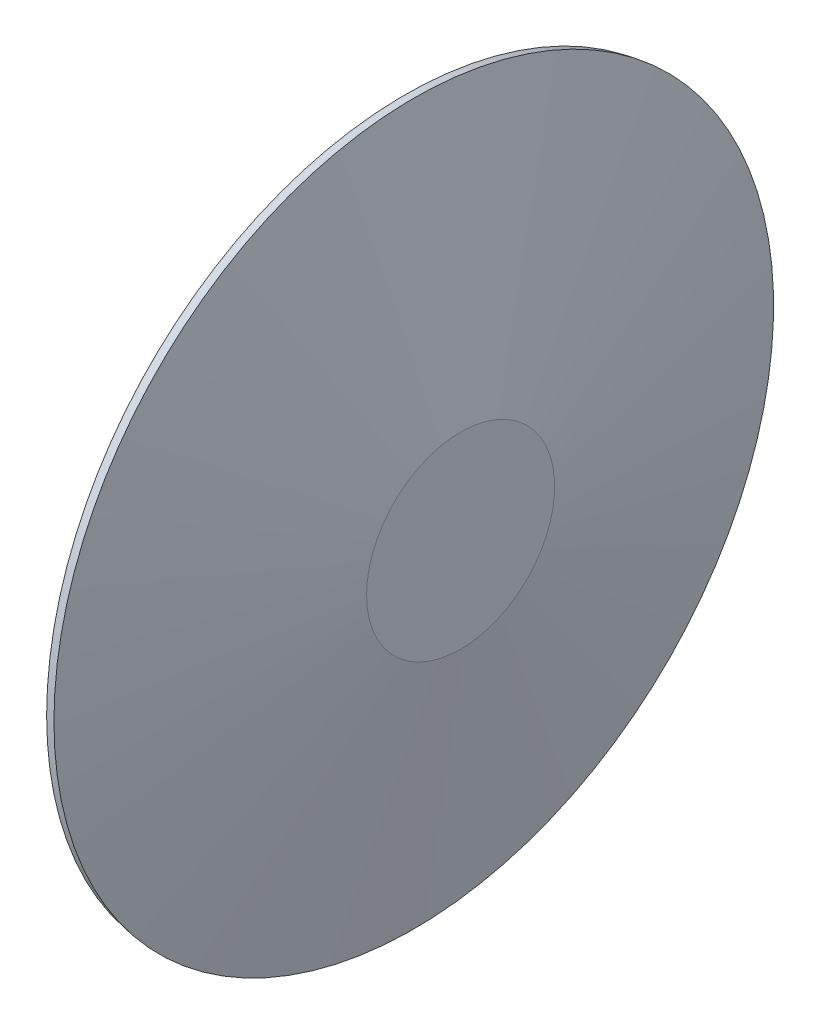
ISO-10303-21;
HEADER;
FILE_DESCRIPTION(('STEP AP214'),'2;1');
FILE_NAME('part.step','',(''),(''),'','','');
FILE_SCHEMA(('AUTOMOTIVE_DESIGN { 1 0 10303 214 1 1 1 1 }'));
ENDSEC;
DATA;
#1=APPLICATION_CONTEXT('core data for automotive mechanical design processes');
#2=APPLICATION_PROTOCOL_DEFINITION('international standard','automotive_design',2000,#1);
#3=PRODUCT_CONTEXT('',#1,'mechanical');
#4=PRODUCT('Part','Part','',(#3));
#5=PRODUCT_RELATED_PRODUCT_CATEGORY('part','',(#4));
#6=PRODUCT_DEFINITION_FORMATION('','',#4);
#7=PRODUCT_DEFINITION_CONTEXT('part definition',#1,'design');
#8=PRODUCT_DEFINITION('design','',#6,#7);
#9=PRODUCT_DEFINITION_SHAPE('','',#8);
#10=(LENGTH_UNIT() NAMED_UNIT(*) SI_UNIT(.MILLI.,.METRE.));
#11=(NAMED_UNIT(*) PLANE_ANGLE_UNIT() SI_UNIT($,.RADIAN.));
#12=(NAMED_UNIT(*) SI_UNIT($,.STERADIAN.) SOLID_ANGLE_UNIT());
#13=UNCERTAINTY_MEASURE_WITH_UNIT(LENGTH_MEASURE(1.E-05),#10,'distance_accuracy_value','');
#14=(GEOMETRIC_REPRESENTATION_CONTEXT(3) GLOBAL_UNCERTAINTY_ASSIGNED_CONTEXT((#13)) GLOBAL_UNIT_ASSIGNED_CONTEXT((#10,
#11,#12)) REPRESENTATION_CONTEXT('',''));
#15=CARTESIAN_POINT('',(0.,0.,0.));
#16=DIRECTION('',(0.,0.,1.));
#17=DIRECTION('',(1.,0.,0.));
#18=AXIS2_PLACEMENT_3D('',#15,#16,#17);
#19=CARTESIAN_POINT('',(0.,0.,0.));
#20=DIRECTION('',(-1.,0.,0.));
#21=DIRECTION('',(0.,0.,1.));
#22=AXIS2_PLACEMENT_3D('',#19,#20,#21);
#23=PLANE('',#22);
#24=CARTESIAN_POINT('',(0.,0.,0.));
#25=DIRECTION('',(-1.,0.,0.));
#26=DIRECTION('',(0.,0.,1.));
#27=AXIS2_PLACEMENT_3D('',#24,#25,#26);
#28=CIRCLE('',#27,20.9115348192675);
#29=CARTESIAN_POINT('',(0.,0.,20.9115348192675));
#30=VERTEX_POINT('',#29);
#31=EDGE_CURVE('E46',#30,#30,#28,.T.);
#32=ORIENTED_EDGE('',*,*,#31,.F.);
#33=EDGE_LOOP('',(#32));
#34=FACE_BOUND('',#33,.T.);
#35=ADVANCED_FACE('F39',(#34),#23,.F.);
#36=CARTESIAN_POINT('',(0.,0.,0.));
#37=DIRECTION('',(-1.,0.,0.));
#38=DIRECTION('',(0.,0.,1.));
#39=AXIS2_PLACEMENT_3D('',#36,#37,#38);
#40=CONICAL_SURFACE('',#39,20.9115348192675,1.39626340159546);
#41=CARTESIAN_POINT('',(-10.4188906600159,0.,0.));
#42=DIRECTION('',(-1.,0.,0.));
#43=DIRECTION('',(0.,0.,1.));
#44=AXIS2_PLACEMENT_3D('',#41,#42,#43);
#45=CIRCLE('',#44,80.);
#46=CARTESIAN_POINT('',(-10.4188906600159,0.,80.));
#47=VERTEX_POINT('',#46);
#48=EDGE_CURVE('E51',#47,#47,#45,.T.);
#49=CARTESIAN_POINT('',(-10.4188906600159,0.,80.));
#50=CARTESIAN_POINT('',(-10.310360548974,0.,79.3844951543674));
#51=CARTESIAN_POINT('',(-10.2018304379322,0.,78.7689903087347));
#52=CARTESIAN_POINT('',(-9.98477021584854,0.,77.5379806174695));
#53=CARTESIAN_POINT('',(-9.87624010480671,0.,76.9224757718368));
#54=CARTESIAN_POINT('',(-9.65917988272305,0.,75.6914660805716));
#55=CARTESIAN_POINT('',(-9.55064977168121,0.,75.0759612349389));
#56=CARTESIAN_POINT('',(-9.33358954959755,0.,73.8449515436737));
#57=CARTESIAN_POINT('',(-9.22505943855572,0.,73.2294466980411));
#58=CARTESIAN_POINT('',(-9.00799921647205,0.,71.9984370067758));
#59=CARTESIAN_POINT('',(-8.89946910543022,0.,71.3829321611432));
#60=CARTESIAN_POINT('',(-8.68240888334656,0.,70.1519224698779));
#61=CARTESIAN_POINT('',(-8.57387877230473,0.,69.5364176242453));
#62=CARTESIAN_POINT('',(-8.35681855022106,0.,68.30540793298));
#63=CARTESIAN_POINT('',(-8.24828843917923,0.,67.6899030873474));
#64=CARTESIAN_POINT('',(-8.03122821709557,0.,66.4588933960821));
#65=CARTESIAN_POINT('',(-7.92269810605373,0.,65.8433885504495));
#66=CARTESIAN_POINT('',(-7.70563788397007,0.,64.6123788591842));
#67=CARTESIAN_POINT('',(-7.59710777292824,0.,63.9968740135516));
#68=CARTESIAN_POINT('',(-7.38004755084457,0.,62.7658643222864));
#69=CARTESIAN_POINT('',(-7.27151743980274,0.,62.1503594766537));
#70=CARTESIAN_POINT('',(-7.05445721771908,0.,60.9193497853885));
#71=CARTESIAN_POINT('',(-6.94592710667724,0.,60.3038449397558));
#72=CARTESIAN_POINT('',(-6.72886688459358,0.,59.0728352484906));
#73=CARTESIAN_POINT('',(-6.62033677355175,0.,58.4573304028579));
#74=CARTESIAN_POINT('',(-6.40327655146809,0.,57.2263207115927));
#75=CARTESIAN_POINT('',(-6.29474644042625,0.,56.6108158659601));
#76=CARTESIAN_POINT('',(-6.07768621834259,0.,55.3798061746948));
#77=CARTESIAN_POINT('',(-5.96915610730076,0.,54.7643013290622));
#78=CARTESIAN_POINT('',(-5.75209588521709,0.,53.5332916377969));
#79=CARTESIAN_POINT('',(-5.64356577417526,0.,52.9177867921643));
#80=CARTESIAN_POINT('',(-5.4265055520916,0.,51.686777100899));
#81=CARTESIAN_POINT('',(-5.31797544104977,0.,51.0712722552664));
#82=CARTESIAN_POINT('',(-5.1009152189661,0.,49.8402625640011));
#83=CARTESIAN_POINT('',(-4.99238510792427,0.,49.2247577183685));
#84=CARTESIAN_POINT('',(-4.7753248858406,0.,47.9937480271032));
#85=CARTESIAN_POINT('',(-4.66679477479877,0.,47.3782431814706));
#86=CARTESIAN_POINT('',(-4.44973455271511,0.,46.1472334902054));
#87=CARTESIAN_POINT('',(-4.34120444167328,0.,45.5317286445727));
#88=CARTESIAN_POINT('',(-4.12414421958961,0.,44.3007189533075));
#89=CARTESIAN_POINT('',(-4.01561410854778,0.,43.6852141076748));
#90=CARTESIAN_POINT('',(-3.79855388646412,0.,42.4542044164096));
#91=CARTESIAN_POINT('',(-3.69002377542228,0.,41.8386995707769));
#92=CARTESIAN_POINT('',(-3.47296355333862,0.,40.6076898795117));
#93=CARTESIAN_POINT('',(-3.36443344229679,0.,39.9921850338791));
#94=CARTESIAN_POINT('',(-3.14737322021312,0.,38.7611753426138));
#95=CARTESIAN_POINT('',(-3.03884310917129,0.,38.1456704969812));
#96=CARTESIAN_POINT('',(-2.82178288708763,0.,36.9146608057159));
#97=CARTESIAN_POINT('',(-2.7132527760458,0.,36.2991559600833));
#98=CARTESIAN_POINT('',(-2.49619255396213,0.,35.068146268818));
#99=CARTESIAN_POINT('',(-2.3876624429203,0.,34.4526414231854));
#100=CARTESIAN_POINT('',(-2.17060222083664,0.,33.2216317319201));
#101=CARTESIAN_POINT('',(-2.0620721097948,0.,32.6061268862875));
#102=CARTESIAN_POINT('',(-1.84501188771114,0.,31.3751171950222));
#103=CARTESIAN_POINT('',(-1.73648177666931,0.,30.7596123493896));
#104=CARTESIAN_POINT('',(-1.51942155458564,0.,29.5286026581244));
#105=CARTESIAN_POINT('',(-1.41089144354381,0.,28.9130978124917));
#106=CARTESIAN_POINT('',(-1.19383122146015,0.,27.6820881212265));
#107=CARTESIAN_POINT('',(-1.08530111041832,0.,27.0665832755938));
#108=CARTESIAN_POINT('',(-0.868240888334651,0.,25.8355735843286));
#109=CARTESIAN_POINT('',(-0.75971077729282,0.,25.2200687386959));
#110=CARTESIAN_POINT('',(-0.542650555209156,0.,23.9890590474307));
#111=CARTESIAN_POINT('',(-0.434120444167323,0.,23.3735542017981));
#112=CARTESIAN_POINT('',(-0.217060222083659,0.,22.1425445105328));
#113=CARTESIAN_POINT('',(-0.108530111041827,0.,21.5270396649002));
#114=CARTESIAN_POINT('',(0.,0.,20.9115348192675));
#115=B_SPLINE_CURVE_WITH_KNOTS('',3,(#49,#50,#51,#52,#53,#54,#55,#56,#57,#58,#59,#60,#61,#62,
#63,#64,#65,#66,#67,#68,#69,#70,#71,#72,#73,#74,#75,#76,#77,#78,#79,#80,#81,#82,#83,#84,#85,#86,
#87,#88,#89,#90,#91,#92,#93,#94,#95,#96,#97,#98,#99,#100,#101,#102,#103,#104,#105,#106,#107,
#108,#109,#110,#111,#112,#113,#114),.UNSPECIFIED.,.F.,.F.,(4,2,2,2,2,2,2,2,2,2,2,2,2,2,2,2,2,2,
2,2,2,2,2,2,2,2,2,2,2,2,2,2,4),(0.,1.875,3.75000000000001,5.625,7.49999999999999,9.375,11.25,
13.125,15.,16.875,18.75,20.625,22.5,24.375,26.25,28.125,30.,31.875,33.75,35.625,37.5,39.375,
41.25,43.125,45.,46.875,48.75,50.625,52.5,54.375,56.2499999999999,58.125,60.),.UNSPECIFIED.);
#116=EDGE_CURVE('BSEAM86',#47,#30,#115,.T.);
#117=ORIENTED_EDGE('',*,*,#48,.F.);
#118=ORIENTED_EDGE('',*,*,#31,.T.);
#119=ORIENTED_EDGE('',*,*,#116,.T.);
#120=ORIENTED_EDGE('',*,*,#116,.F.);
#121=EDGE_LOOP('',(#117,#119,#118,#120));
#122=FACE_BOUND('',#121,.T.);
#123=ADVANCED_FACE('F86',(#122),#40,.T.);
#124=CARTESIAN_POINT('',(-10.4188906600159,0.,0.));
#125=DIRECTION('',(1.,0.,0.));
#126=DIRECTION('',(0.,0.,-1.));
#127=AXIS2_PLACEMENT_3D('',#124,#125,#126);
#128=CONICAL_SURFACE('',#127,80.,0.174532925199424);
#129=CARTESIAN_POINT('',(-12.3885061660403,0.,0.));
#130=DIRECTION('',(-1.,0.,0.));
#131=DIRECTION('',(0.,0.,1.));
#132=AXIS2_PLACEMENT_3D('',#129,#130,#131);
#133=CIRCLE('',#132,79.6527036446662);
#134=CARTESIAN_POINT('',(-12.3885061660403,0.,79.6527036446662));
#135=VERTEX_POINT('',#134);
#136=EDGE_CURVE('E56',#135,#135,#133,.T.);
#137=ORIENTED_EDGE('',*,*,#136,.F.);
#138=EDGE_LOOP('',(#137));
#139=FACE_BOUND('',#138,.T.);
#140=ORIENTED_EDGE('',*,*,#48,.T.);
#141=EDGE_LOOP('',(#140));
#142=FACE_BOUND('',#141,.T.);
#143=ADVANCED_FACE('F91',(#139,#142),#128,.T.);
#144=CARTESIAN_POINT('',(-12.3885061660403,0.,0.));
#145=DIRECTION('',(-1.,0.,0.));
#146=DIRECTION('',(0.,0.,1.));
#147=AXIS2_PLACEMENT_3D('',#144,#145,#146);
#148=CONICAL_SURFACE('',#147,79.6527036446662,1.39626340159546);
#149=CARTESIAN_POINT('',(-2.,0.,0.));
#150=DIRECTION('',(-1.,0.,0.));
#151=DIRECTION('',(0.,0.,1.));
#152=AXIS2_PLACEMENT_3D('',#149,#150,#151);
#153=CIRCLE('',#152,20.7365574922158);
#154=CARTESIAN_POINT('',(-2.,0.,20.7365574922158));
#155=VERTEX_POINT('',#154);
#156=EDGE_CURVE('E62',#155,#155,#153,.T.);
#157=CARTESIAN_POINT('',(-2.,0.,20.7365574922158));
#158=CARTESIAN_POINT('',(-2.10821360589625,0.,21.3502673479705));
#159=CARTESIAN_POINT('',(-2.21642721179251,0.,21.9639772037252));
#160=CARTESIAN_POINT('',(-2.43285442358501,0.,23.1913969152346));
#161=CARTESIAN_POINT('',(-2.54106802948126,0.,23.8051067709893));
#162=CARTESIAN_POINT('',(-2.75749524127377,0.,25.0325264824987));
#163=CARTESIAN_POINT('',(-2.86570884717002,0.,25.6462363382533));
#164=CARTESIAN_POINT('',(-3.08213605896253,0.,26.8736560497627));
#165=CARTESIAN_POINT('',(-3.19034966485878,0.,27.4873659055174));
#166=CARTESIAN_POINT('',(-3.40677687665129,0.,28.7147856170268));
#167=CARTESIAN_POINT('',(-3.51499048254754,0.,29.3284954727815));
#168=CARTESIAN_POINT('',(-3.73141769434005,0.,30.5559151842909));
#169=CARTESIAN_POINT('',(-3.8396313002363,0.,31.1696250400456));
#170=CARTESIAN_POINT('',(-4.05605851202881,0.,32.3970447515549));
#171=CARTESIAN_POINT('',(-4.16427211792506,0.,33.0107546073096));
#172=CARTESIAN_POINT('',(-4.38069932971757,0.,34.238174318819));
#173=CARTESIAN_POINT('',(-4.48891293561382,0.,34.8518841745737));
#174=CARTESIAN_POINT('',(-4.70534014740633,0.,36.0793038860831));
#175=CARTESIAN_POINT('',(-4.81355375330258,0.,36.6930137418378));
#176=CARTESIAN_POINT('',(-5.02998096509508,0.,37.9204334533472));
#177=CARTESIAN_POINT('',(-5.13819457099134,0.,38.5341433091019));
#178=CARTESIAN_POINT('',(-5.35462178278384,0.,39.7615630206112));
#179=CARTESIAN_POINT('',(-5.4628353886801,0.,40.3752728763659));
#180=CARTESIAN_POINT('',(-5.6792626004726,0.,41.6026925878753));
#181=CARTESIAN_POINT('',(-5.78747620636886,0.,42.21640244363));
#182=CARTESIAN_POINT('',(-6.00390341816136,0.,43.4438221551394));
#183=CARTESIAN_POINT('',(-6.11211702405761,0.,44.0575320108941));
#184=CARTESIAN_POINT('',(-6.32854423585012,0.,45.2849517224035));
#185=CARTESIAN_POINT('',(-6.43675784174637,0.,45.8986615781582));
#186=CARTESIAN_POINT('',(-6.65318505353888,0.,47.1260812896675));
#187=CARTESIAN_POINT('',(-6.76139865943513,0.,47.7397911454222));
#188=CARTESIAN_POINT('',(-6.97782587122764,0.,48.9672108569316));
#189=CARTESIAN_POINT('',(-7.08603947712389,0.,49.5809207126863));
#190=CARTESIAN_POINT('',(-7.3024666889164,0.,50.8083404241957));
#191=CARTESIAN_POINT('',(-7.41068029481265,0.,51.4220502799504));
#192=CARTESIAN_POINT('',(-7.62710750660516,0.,52.6494699914598));
#193=CARTESIAN_POINT('',(-7.73532111250141,0.,53.2631798472144));
#194=CARTESIAN_POINT('',(-7.95174832429391,0.,54.4905995587238));
#195=CARTESIAN_POINT('',(-8.05996193019017,0.,55.1043094144785));
#196=CARTESIAN_POINT('',(-8.27638914198267,0.,56.3317291259879));
#197=CARTESIAN_POINT('',(-8.38460274787893,0.,56.9454389817426));
#198=CARTESIAN_POINT('',(-8.60102995967143,0.,58.172858693252));
#199=CARTESIAN_POINT('',(-8.70924356556769,0.,58.7865685490067));
#200=CARTESIAN_POINT('',(-8.92567077736019,0.,60.0139882605161));
#201=CARTESIAN_POINT('',(-9.03388438325645,0.,60.6276981162707));
#202=CARTESIAN_POINT('',(-9.25031159504895,0.,61.8551178277801));
#203=CARTESIAN_POINT('',(-9.3585252009452,0.,62.4688276835348));
#204=CARTESIAN_POINT('',(-9.57495241273771,0.,63.6962473950442));
#205=CARTESIAN_POINT('',(-9.68316601863396,0.,64.3099572507989));
#206=CARTESIAN_POINT('',(-9.89959323042647,0.,65.5373769623083));
#207=CARTESIAN_POINT('',(-10.0078068363227,0.,66.151086818063));
#208=CARTESIAN_POINT('',(-10.2242340481152,0.,67.3785065295723));
#209=CARTESIAN_POINT('',(-10.3324476540115,0.,67.992216385327));
#210=CARTESIAN_POINT('',(-10.548874865804,0.,69.2196360968364));
#211=CARTESIAN_POINT('',(-10.6570884717002,0.,69.8333459525911));
#212=CARTESIAN_POINT('',(-10.8735156834927,0.,71.0607656641005));
#213=CARTESIAN_POINT('',(-10.981729289389,0.,71.6744755198552));
#214=CARTESIAN_POINT('',(-11.1981565011815,0.,72.9018952313646));
#215=CARTESIAN_POINT('',(-11.3063701070778,0.,73.5156050871192));
#216=CARTESIAN_POINT('',(-11.5227973188703,0.,74.7430247986286));
#217=CARTESIAN_POINT('',(-11.6310109247665,0.,75.3567346543833));
#218=CARTESIAN_POINT('',(-11.847438136559,0.,76.5841543658927));
#219=CARTESIAN_POINT('',(-11.9556517424553,0.,77.1978642216474));
#220=CARTESIAN_POINT('',(-12.1720789542478,0.,78.4252839331568));
#221=CARTESIAN_POINT('',(-12.280292560144,0.,79.0389937889115));
#222=CARTESIAN_POINT('',(-12.3885061660403,0.,79.6527036446662));
#223=B_SPLINE_CURVE_WITH_KNOTS('',3,(#157,#158,#159,#160,#161,#162,#163,#164,#165,#166,#167,
#168,#169,#170,#171,#172,#173,#174,#175,#176,#177,#178,#179,#180,#181,#182,#183,#184,#185,#186,
#187,#188,#189,#190,#191,#192,#193,#194,#195,#196,#197,#198,#199,#200,#201,#202,#203,#204,#205,
#206,#207,#208,#209,#210,#211,#212,#213,#214,#215,#216,#217,#218,#219,#220,#221,#222),
.UNSPECIFIED.,.F.,.F.,(4,2,2,2,2,2,2,2,2,2,2,2,2,2,2,2,2,2,2,2,2,2,2,2,2,2,2,2,2,2,2,2,4),(0.,
1.86953195852963,3.73906391705925,5.60859587558888,7.4781278341185,9.34765979264813,
11.2171917511777,13.0867237097074,14.956255668237,16.8257876267666,18.6953195852963,
20.5648515438259,22.4343835023555,24.3039154608851,26.1734474194148,28.0429793779444,
29.912511336474,31.7820432950036,33.6515752535333,35.5211072120629,37.3906391705925,
39.2601711291221,41.1297030876518,42.9992350461814,44.868767004711,46.7382989632406,
48.6078309217703,50.4773628802999,52.3468948388295,54.2164267973591,56.0859587558888,
57.9554907144184,59.825022672948),.UNSPECIFIED.);
#224=EDGE_CURVE('BSEAM82',#155,#135,#223,.T.);
#225=ORIENTED_EDGE('',*,*,#156,.F.);
#226=ORIENTED_EDGE('',*,*,#136,.T.);
#227=ORIENTED_EDGE('',*,*,#224,.T.);
#228=ORIENTED_EDGE('',*,*,#224,.F.);
#229=EDGE_LOOP('',(#225,#227,#226,#228));
#230=FACE_BOUND('',#229,.T.);
#231=ADVANCED_FACE('F82',(#230),#148,.F.);
#232=CARTESIAN_POINT('',(-2.,20.7365574922158,0.));
#233=DIRECTION('',(1.,0.,0.));
#234=DIRECTION('',(0.,0.,-1.));
#235=AXIS2_PLACEMENT_3D('',#232,#233,#234);
#236=PLANE('',#235);
#237=CARTESIAN_POINT('',(-2.,0.,0.));
#238=DIRECTION('',(1.,0.,0.));
#239=DIRECTION('',(0.,0.,-1.));
#240=AXIS2_PLACEMENT_3D('',#237,#238,#239);
#241=CIRCLE('',#240,7.5);
#242=CARTESIAN_POINT('',(-2.,0.,-7.5));
#243=VERTEX_POINT('',#242);
#244=EDGE_CURVE('E10',#243,#243,#241,.F.);
#245=ORIENTED_EDGE('',*,*,#244,.F.);
#246=EDGE_LOOP('',(#245));
#247=FACE_BOUND('',#246,.T.);
#248=ORIENTED_EDGE('',*,*,#156,.T.);
#249=EDGE_LOOP('',(#248));
#250=FACE_BOUND('',#249,.T.);
#251=ADVANCED_FACE('F75',(#247,#250),#236,.F.);
#252=CARTESIAN_POINT('',(-52.,0.,0.));
#253=DIRECTION('',(1.,0.,0.));
#254=DIRECTION('',(0.,0.,-1.));
#255=AXIS2_PLACEMENT_3D('',#252,#253,#254);
#256=CYLINDRICAL_SURFACE('',#255,7.5);
#257=CARTESIAN_POINT('',(-52.,0.,0.));
#258=DIRECTION('',(-1.,0.,0.));
#259=DIRECTION('',(0.,0.,1.));
#260=AXIS2_PLACEMENT_3D('',#257,#258,#259);
#261=CIRCLE('',#260,7.5);
#262=CARTESIAN_POINT('',(-52.,0.,7.5));
#263=VERTEX_POINT('',#262);
#264=EDGE_CURVE('E66',#263,#263,#261,.T.);
#265=ORIENTED_EDGE('',*,*,#264,.F.);
#266=EDGE_LOOP('',(#265));
#267=FACE_BOUND('',#266,.T.);
#268=ORIENTED_EDGE('',*,*,#244,.T.);
#269=EDGE_LOOP('',(#268));
#270=FACE_BOUND('',#269,.T.);
#271=ADVANCED_FACE('F73',(#267,#270),#256,.T.);
#272=CARTESIAN_POINT('',(-52.,0.,0.));
#273=DIRECTION('',(-1.,0.,0.));
#274=DIRECTION('',(0.,0.,1.));
#275=AXIS2_PLACEMENT_3D('',#272,#273,#274);
#276=PLANE('',#275);
#277=ORIENTED_EDGE('',*,*,#264,.T.);
#278=EDGE_LOOP('',(#277));
#279=FACE_BOUND('',#278,.T.);
#280=ADVANCED_FACE('F71',(#279),#276,.T.);
#281=CLOSED_SHELL('',(#35,#123,#143,#231,#251,#271,#280));
#282=MANIFOLD_SOLID_BREP('B2',#281);
#283=ADVANCED_BREP_SHAPE_REPRESENTATION('',(#18,#282),#14);
#284=SHAPE_DEFINITION_REPRESENTATION(#9,#283);
ENDSEC;
END-ISO-10303-21;
